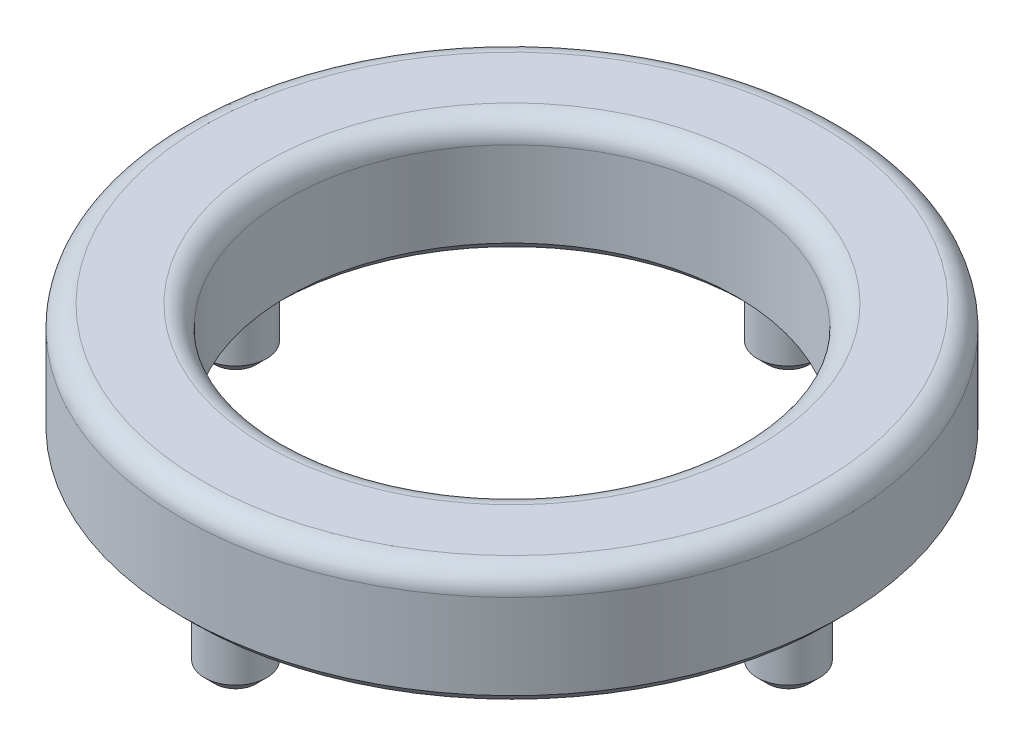
ISO-10303-21;
HEADER;
FILE_DESCRIPTION(('STEP AP214'),'2;1');
FILE_NAME('part.step','',(''),(''),'','','');
FILE_SCHEMA(('AUTOMOTIVE_DESIGN { 1 0 10303 214 1 1 1 1 }'));
ENDSEC;
DATA;
#1=APPLICATION_CONTEXT('core data for automotive mechanical design processes');
#2=APPLICATION_PROTOCOL_DEFINITION('international standard','automotive_design',2000,#1);
#3=PRODUCT_CONTEXT('',#1,'mechanical');
#4=PRODUCT('Part','Part','',(#3));
#5=PRODUCT_RELATED_PRODUCT_CATEGORY('part','',(#4));
#6=PRODUCT_DEFINITION_FORMATION('','',#4);
#7=PRODUCT_DEFINITION_CONTEXT('part definition',#1,'design');
#8=PRODUCT_DEFINITION('design','',#6,#7);
#9=PRODUCT_DEFINITION_SHAPE('','',#8);
#10=(LENGTH_UNIT() NAMED_UNIT(*) SI_UNIT(.MILLI.,.METRE.));
#11=(NAMED_UNIT(*) PLANE_ANGLE_UNIT() SI_UNIT($,.RADIAN.));
#12=(NAMED_UNIT(*) SI_UNIT($,.STERADIAN.) SOLID_ANGLE_UNIT());
#13=UNCERTAINTY_MEASURE_WITH_UNIT(LENGTH_MEASURE(1.E-05),#10,'distance_accuracy_value','');
#14=(GEOMETRIC_REPRESENTATION_CONTEXT(3) GLOBAL_UNCERTAINTY_ASSIGNED_CONTEXT((#13)) GLOBAL_UNIT_ASSIGNED_CONTEXT((#10,
#11,#12)) REPRESENTATION_CONTEXT('',''));
#15=CARTESIAN_POINT('',(0.,0.,0.));
#16=DIRECTION('',(0.,0.,1.));
#17=DIRECTION('',(1.,0.,0.));
#18=AXIS2_PLACEMENT_3D('',#15,#16,#17);
#19=CARTESIAN_POINT('',(0.,11.,0.));
#20=DIRECTION('',(0.,1.,0.));
#21=DIRECTION('',(0.,0.,1.));
#22=AXIS2_PLACEMENT_3D('',#19,#20,#21);
#23=PLANE('',#22);
#24=CARTESIAN_POINT('',(0.,11.,0.));
#25=DIRECTION('',(0.,1.,0.));
#26=DIRECTION('',(0.,0.,1.));
#27=AXIS2_PLACEMENT_3D('',#24,#25,#26);
#28=CIRCLE('',#27,23.15);
#29=CARTESIAN_POINT('',(0.,11.,23.15));
#30=VERTEX_POINT('',#29);
#31=EDGE_CURVE('E74',#30,#30,#28,.F.);
#32=ORIENTED_EDGE('',*,*,#31,.T.);
#33=EDGE_LOOP('',(#32));
#34=FACE_BOUND('',#33,.T.);
#35=CARTESIAN_POINT('',(0.,11.,0.));
#36=DIRECTION('',(0.,1.,0.));
#37=DIRECTION('',(0.,0.,1.));
#38=AXIS2_PLACEMENT_3D('',#35,#36,#37);
#39=CIRCLE('',#38,29.);
#40=CARTESIAN_POINT('',(0.,11.,29.));
#41=VERTEX_POINT('',#40);
#42=EDGE_CURVE('E77',#41,#41,#39,.T.);
#43=ORIENTED_EDGE('',*,*,#42,.T.);
#44=EDGE_LOOP('',(#43));
#45=FACE_BOUND('',#44,.T.);
#46=ADVANCED_FACE('F39',(#34,#45),#23,.T.);
#47=CARTESIAN_POINT('',(0.,0.,0.));
#48=DIRECTION('',(0.,1.,0.));
#49=DIRECTION('',(0.,0.,1.));
#50=AXIS2_PLACEMENT_3D('',#47,#48,#49);
#51=PLANE('',#50);
#52=CARTESIAN_POINT('',(26.,0.,0.));
#53=DIRECTION('',(0.,1.,0.));
#54=DIRECTION('',(0.,0.,1.));
#55=AXIS2_PLACEMENT_3D('',#52,#53,#54);
#56=CIRCLE('',#55,3.325);
#57=CARTESIAN_POINT('',(26.,0.,3.325));
#58=VERTEX_POINT('',#57);
#59=EDGE_CURVE('E59',#58,#58,#56,.T.);
#60=ORIENTED_EDGE('',*,*,#59,.T.);
#61=EDGE_LOOP('',(#60));
#62=FACE_BOUND('',#61,.T.);
#63=CARTESIAN_POINT('',(0.,0.,26.));
#64=DIRECTION('',(0.,1.,0.));
#65=DIRECTION('',(0.,0.,1.));
#66=AXIS2_PLACEMENT_3D('',#63,#64,#65);
#67=CIRCLE('',#66,3.325);
#68=CARTESIAN_POINT('',(0.,0.,29.325));
#69=VERTEX_POINT('',#68);
#70=EDGE_CURVE('E62',#69,#69,#67,.T.);
#71=ORIENTED_EDGE('',*,*,#70,.T.);
#72=EDGE_LOOP('',(#71));
#73=FACE_BOUND('',#72,.T.);
#74=CARTESIAN_POINT('',(-26.,0.,0.));
#75=DIRECTION('',(0.,1.,0.));
#76=DIRECTION('',(0.,0.,1.));
#77=AXIS2_PLACEMENT_3D('',#74,#75,#76);
#78=CIRCLE('',#77,3.325);
#79=CARTESIAN_POINT('',(-26.,0.,3.325));
#80=VERTEX_POINT('',#79);
#81=EDGE_CURVE('E65',#80,#80,#78,.T.);
#82=ORIENTED_EDGE('',*,*,#81,.T.);
#83=EDGE_LOOP('',(#82));
#84=FACE_BOUND('',#83,.T.);
#85=CARTESIAN_POINT('',(0.,0.,-26.));
#86=DIRECTION('',(0.,1.,0.));
#87=DIRECTION('',(0.,0.,1.));
#88=AXIS2_PLACEMENT_3D('',#85,#86,#87);
#89=CIRCLE('',#88,3.325);
#90=CARTESIAN_POINT('',(0.,0.,-22.675));
#91=VERTEX_POINT('',#90);
#92=EDGE_CURVE('E68',#91,#91,#89,.T.);
#93=ORIENTED_EDGE('',*,*,#92,.T.);
#94=EDGE_LOOP('',(#93));
#95=FACE_BOUND('',#94,.T.);
#96=CARTESIAN_POINT('',(0.,0.,0.));
#97=DIRECTION('',(0.,1.,0.));
#98=DIRECTION('',(0.,0.,1.));
#99=AXIS2_PLACEMENT_3D('',#96,#97,#98);
#100=CIRCLE('',#99,22.15);
#101=CARTESIAN_POINT('',(0.,0.,22.15));
#102=VERTEX_POINT('',#101);
#103=EDGE_CURVE('E89',#102,#102,#100,.T.);
#104=ORIENTED_EDGE('',*,*,#103,.T.);
#105=EDGE_LOOP('',(#104));
#106=FACE_BOUND('',#105,.T.);
#107=CARTESIAN_POINT('',(0.,0.,0.));
#108=DIRECTION('',(0.,1.,0.));
#109=DIRECTION('',(0.,0.,1.));
#110=AXIS2_PLACEMENT_3D('',#107,#108,#109);
#111=CIRCLE('',#110,30.);
#112=CARTESIAN_POINT('',(0.,0.,30.));
#113=VERTEX_POINT('',#112);
#114=EDGE_CURVE('E92',#113,#113,#111,.F.);
#115=ORIENTED_EDGE('',*,*,#114,.T.);
#116=EDGE_LOOP('',(#115));
#117=FACE_BOUND('',#116,.T.);
#118=ADVANCED_FACE('F141',(#62,#73,#84,#95,#106,#117),#51,.F.);
#119=CARTESIAN_POINT('',(0.,11.,0.));
#120=DIRECTION('',(0.,-1.,0.));
#121=DIRECTION('',(0.,0.,-1.));
#122=AXIS2_PLACEMENT_3D('',#119,#120,#121);
#123=CYLINDRICAL_SURFACE('',#122,31.);
#124=CARTESIAN_POINT('',(0.,9.,0.));
#125=DIRECTION('',(0.,1.,0.));
#126=DIRECTION('',(0.,0.,1.));
#127=AXIS2_PLACEMENT_3D('',#124,#125,#126);
#128=CIRCLE('',#127,31.);
#129=CARTESIAN_POINT('',(0.,9.,31.));
#130=VERTEX_POINT('',#129);
#131=EDGE_CURVE('E71',#130,#130,#128,.F.);
#132=ORIENTED_EDGE('',*,*,#131,.T.);
#133=EDGE_LOOP('',(#132));
#134=FACE_BOUND('',#133,.T.);
#135=CARTESIAN_POINT('',(0.,1.00000000000001,0.));
#136=DIRECTION('',(0.,1.,0.));
#137=DIRECTION('',(0.,0.,1.));
#138=AXIS2_PLACEMENT_3D('',#135,#136,#137);
#139=CIRCLE('',#138,31.);
#140=CARTESIAN_POINT('',(0.,1.00000000000001,31.));
#141=VERTEX_POINT('',#140);
#142=EDGE_CURVE('E83',#141,#141,#139,.T.);
#143=ORIENTED_EDGE('',*,*,#142,.T.);
#144=EDGE_LOOP('',(#143));
#145=FACE_BOUND('',#144,.T.);
#146=ADVANCED_FACE('F147',(#134,#145),#123,.T.);
#147=CARTESIAN_POINT('',(0.,11.,0.));
#148=DIRECTION('',(0.,-1.,0.));
#149=DIRECTION('',(0.,0.,-1.));
#150=AXIS2_PLACEMENT_3D('',#147,#148,#149);
#151=CYLINDRICAL_SURFACE('',#150,21.15);
#152=CARTESIAN_POINT('',(0.,9.,0.));
#153=DIRECTION('',(0.,1.,0.));
#154=DIRECTION('',(0.,0.,1.));
#155=AXIS2_PLACEMENT_3D('',#152,#153,#154);
#156=CIRCLE('',#155,21.15);
#157=CARTESIAN_POINT('',(0.,9.,21.15));
#158=VERTEX_POINT('',#157);
#159=EDGE_CURVE('E80',#158,#158,#156,.T.);
#160=ORIENTED_EDGE('',*,*,#159,.T.);
#161=EDGE_LOOP('',(#160));
#162=FACE_BOUND('',#161,.T.);
#163=CARTESIAN_POINT('',(0.,0.999999999999997,0.));
#164=DIRECTION('',(0.,1.,0.));
#165=DIRECTION('',(0.,0.,1.));
#166=AXIS2_PLACEMENT_3D('',#163,#164,#165);
#167=CIRCLE('',#166,21.15);
#168=CARTESIAN_POINT('',(0.,0.999999999999997,21.15));
#169=VERTEX_POINT('',#168);
#170=EDGE_CURVE('E86',#169,#169,#167,.F.);
#171=ORIENTED_EDGE('',*,*,#170,.T.);
#172=EDGE_LOOP('',(#171));
#173=FACE_BOUND('',#172,.T.);
#174=ADVANCED_FACE('F152',(#162,#173),#151,.F.);
#175=CARTESIAN_POINT('',(0.,-6.,-26.));
#176=DIRECTION('',(0.,1.,0.));
#177=DIRECTION('',(0.,0.,1.));
#178=AXIS2_PLACEMENT_3D('',#175,#176,#177);
#179=CYLINDRICAL_SURFACE('',#178,2.925);
#180=CARTESIAN_POINT('',(0.,-0.4,-26.));
#181=DIRECTION('',(0.,1.,0.));
#182=DIRECTION('',(0.,0.,1.));
#183=AXIS2_PLACEMENT_3D('',#180,#181,#182);
#184=CIRCLE('',#183,2.925);
#185=CARTESIAN_POINT('',(0.,-0.4,-23.075));
#186=VERTEX_POINT('',#185);
#187=EDGE_CURVE('E11',#186,#186,#184,.F.);
#188=ORIENTED_EDGE('',*,*,#187,.T.);
#189=EDGE_LOOP('',(#188));
#190=FACE_BOUND('',#189,.T.);
#191=CARTESIAN_POINT('',(0.,-4.99999999999999,-26.));
#192=DIRECTION('',(0.,1.,0.));
#193=DIRECTION('',(0.,0.,1.));
#194=AXIS2_PLACEMENT_3D('',#191,#192,#193);
#195=CIRCLE('',#194,2.925);
#196=CARTESIAN_POINT('',(0.,-4.99999999999999,-23.075));
#197=VERTEX_POINT('',#196);
#198=EDGE_CURVE('E110',#197,#197,#195,.T.);
#199=ORIENTED_EDGE('',*,*,#198,.T.);
#200=EDGE_LOOP('',(#199));
#201=FACE_BOUND('',#200,.T.);
#202=ADVANCED_FACE('F159',(#190,#201),#179,.T.);
#203=CARTESIAN_POINT('',(0.,-6.,0.));
#204=DIRECTION('',(0.,1.,0.));
#205=DIRECTION('',(0.,0.,1.));
#206=AXIS2_PLACEMENT_3D('',#203,#204,#205);
#207=PLANE('',#206);
#208=CARTESIAN_POINT('',(0.,-6.,-26.));
#209=DIRECTION('',(0.,1.,0.));
#210=DIRECTION('',(0.,0.,1.));
#211=AXIS2_PLACEMENT_3D('',#208,#209,#210);
#212=CIRCLE('',#211,1.92499999999998);
#213=CARTESIAN_POINT('',(0.,-6.,-24.075));
#214=VERTEX_POINT('',#213);
#215=EDGE_CURVE('E107',#214,#214,#212,.F.);
#216=ORIENTED_EDGE('',*,*,#215,.T.);
#217=EDGE_LOOP('',(#216));
#218=FACE_BOUND('',#217,.T.);
#219=ADVANCED_FACE('F264',(#218),#207,.F.);
#220=CARTESIAN_POINT('',(0.,-6.,26.));
#221=DIRECTION('',(0.,1.,0.));
#222=DIRECTION('',(0.,0.,1.));
#223=AXIS2_PLACEMENT_3D('',#220,#221,#222);
#224=CYLINDRICAL_SURFACE('',#223,2.925);
#225=CARTESIAN_POINT('',(0.,-0.4,26.));
#226=DIRECTION('',(0.,1.,0.));
#227=DIRECTION('',(0.,0.,1.));
#228=AXIS2_PLACEMENT_3D('',#225,#226,#227);
#229=CIRCLE('',#228,2.925);
#230=CARTESIAN_POINT('',(0.,-0.4,28.925));
#231=VERTEX_POINT('',#230);
#232=EDGE_CURVE('E50',#231,#231,#229,.F.);
#233=ORIENTED_EDGE('',*,*,#232,.T.);
#234=EDGE_LOOP('',(#233));
#235=FACE_BOUND('',#234,.T.);
#236=CARTESIAN_POINT('',(0.,-4.99999999999999,26.));
#237=DIRECTION('',(0.,1.,0.));
#238=DIRECTION('',(0.,0.,1.));
#239=AXIS2_PLACEMENT_3D('',#236,#237,#238);
#240=CIRCLE('',#239,2.925);
#241=CARTESIAN_POINT('',(0.,-4.99999999999999,28.925));
#242=VERTEX_POINT('',#241);
#243=EDGE_CURVE('E98',#242,#242,#240,.T.);
#244=ORIENTED_EDGE('',*,*,#243,.T.);
#245=EDGE_LOOP('',(#244));
#246=FACE_BOUND('',#245,.T.);
#247=ADVANCED_FACE('F259',(#235,#246),#224,.T.);
#248=CARTESIAN_POINT('',(0.,-6.,26.));
#249=DIRECTION('',(0.,1.,0.));
#250=DIRECTION('',(0.,0.,1.));
#251=AXIS2_PLACEMENT_3D('',#248,#249,#250);
#252=PLANE('',#251);
#253=CARTESIAN_POINT('',(0.,-6.,26.));
#254=DIRECTION('',(0.,1.,0.));
#255=DIRECTION('',(0.,0.,1.));
#256=AXIS2_PLACEMENT_3D('',#253,#254,#255);
#257=CIRCLE('',#256,1.92499999999998);
#258=CARTESIAN_POINT('',(0.,-6.,27.925));
#259=VERTEX_POINT('',#258);
#260=EDGE_CURVE('E95',#259,#259,#257,.F.);
#261=ORIENTED_EDGE('',*,*,#260,.T.);
#262=EDGE_LOOP('',(#261));
#263=FACE_BOUND('',#262,.T.);
#264=ADVANCED_FACE('F252',(#263),#252,.F.);
#265=CARTESIAN_POINT('',(-26.,-6.,0.));
#266=DIRECTION('',(0.,1.,0.));
#267=DIRECTION('',(0.,0.,1.));
#268=AXIS2_PLACEMENT_3D('',#265,#266,#267);
#269=CYLINDRICAL_SURFACE('',#268,2.925);
#270=CARTESIAN_POINT('',(-26.,-0.4,0.));
#271=DIRECTION('',(0.,1.,0.));
#272=DIRECTION('',(0.,0.,1.));
#273=AXIS2_PLACEMENT_3D('',#270,#271,#272);
#274=CIRCLE('',#273,2.925);
#275=CARTESIAN_POINT('',(-26.,-0.4,2.925));
#276=VERTEX_POINT('',#275);
#277=EDGE_CURVE('E46',#276,#276,#274,.F.);
#278=ORIENTED_EDGE('',*,*,#277,.T.);
#279=EDGE_LOOP('',(#278));
#280=FACE_BOUND('',#279,.T.);
#281=CARTESIAN_POINT('',(-26.,-4.99999999999998,0.));
#282=DIRECTION('',(0.,1.,0.));
#283=DIRECTION('',(0.,0.,1.));
#284=AXIS2_PLACEMENT_3D('',#281,#282,#283);
#285=CIRCLE('',#284,2.925);
#286=CARTESIAN_POINT('',(-26.,-4.99999999999998,2.925));
#287=VERTEX_POINT('',#286);
#288=EDGE_CURVE('E116',#287,#287,#285,.T.);
#289=ORIENTED_EDGE('',*,*,#288,.T.);
#290=EDGE_LOOP('',(#289));
#291=FACE_BOUND('',#290,.T.);
#292=ADVANCED_FACE('F120',(#280,#291),#269,.T.);
#293=CARTESIAN_POINT('',(-26.,-6.,0.));
#294=DIRECTION('',(0.,1.,0.));
#295=DIRECTION('',(0.,0.,1.));
#296=AXIS2_PLACEMENT_3D('',#293,#294,#295);
#297=PLANE('',#296);
#298=CARTESIAN_POINT('',(-26.,-6.,0.));
#299=DIRECTION('',(0.,1.,0.));
#300=DIRECTION('',(0.,0.,1.));
#301=AXIS2_PLACEMENT_3D('',#298,#299,#300);
#302=CIRCLE('',#301,1.92499999999998);
#303=CARTESIAN_POINT('',(-26.,-6.,1.92499999999998));
#304=VERTEX_POINT('',#303);
#305=EDGE_CURVE('E113',#304,#304,#302,.F.);
#306=ORIENTED_EDGE('',*,*,#305,.T.);
#307=EDGE_LOOP('',(#306));
#308=FACE_BOUND('',#307,.T.);
#309=ADVANCED_FACE('F239',(#308),#297,.F.);
#310=CARTESIAN_POINT('',(26.,-6.,0.));
#311=DIRECTION('',(0.,1.,0.));
#312=DIRECTION('',(0.,0.,1.));
#313=AXIS2_PLACEMENT_3D('',#310,#311,#312);
#314=CYLINDRICAL_SURFACE('',#313,2.925);
#315=CARTESIAN_POINT('',(26.,-0.4,0.));
#316=DIRECTION('',(0.,1.,0.));
#317=DIRECTION('',(0.,0.,1.));
#318=AXIS2_PLACEMENT_3D('',#315,#316,#317);
#319=CIRCLE('',#318,2.925);
#320=CARTESIAN_POINT('',(26.,-0.4,2.925));
#321=VERTEX_POINT('',#320);
#322=EDGE_CURVE('E54',#321,#321,#319,.F.);
#323=ORIENTED_EDGE('',*,*,#322,.T.);
#324=EDGE_LOOP('',(#323));
#325=FACE_BOUND('',#324,.T.);
#326=CARTESIAN_POINT('',(26.,-4.99999999999998,0.));
#327=DIRECTION('',(0.,1.,0.));
#328=DIRECTION('',(0.,0.,1.));
#329=AXIS2_PLACEMENT_3D('',#326,#327,#328);
#330=CIRCLE('',#329,2.925);
#331=CARTESIAN_POINT('',(26.,-4.99999999999998,2.925));
#332=VERTEX_POINT('',#331);
#333=EDGE_CURVE('E104',#332,#332,#330,.T.);
#334=ORIENTED_EDGE('',*,*,#333,.T.);
#335=EDGE_LOOP('',(#334));
#336=FACE_BOUND('',#335,.T.);
#337=ADVANCED_FACE('F135',(#325,#336),#314,.T.);
#338=CARTESIAN_POINT('',(26.,-6.,0.));
#339=DIRECTION('',(0.,1.,0.));
#340=DIRECTION('',(0.,0.,1.));
#341=AXIS2_PLACEMENT_3D('',#338,#339,#340);
#342=PLANE('',#341);
#343=CARTESIAN_POINT('',(26.,-6.,0.));
#344=DIRECTION('',(0.,1.,0.));
#345=DIRECTION('',(0.,0.,1.));
#346=AXIS2_PLACEMENT_3D('',#343,#344,#345);
#347=CIRCLE('',#346,1.92499999999998);
#348=CARTESIAN_POINT('',(26.,-6.,1.92499999999998));
#349=VERTEX_POINT('',#348);
#350=EDGE_CURVE('E101',#349,#349,#347,.F.);
#351=ORIENTED_EDGE('',*,*,#350,.T.);
#352=EDGE_LOOP('',(#351));
#353=FACE_BOUND('',#352,.T.);
#354=ADVANCED_FACE('F125',(#353),#342,.F.);
#355=CARTESIAN_POINT('',(-26.,-4.99999999999998,0.));
#356=DIRECTION('',(0.,1.,0.));
#357=DIRECTION('',(0.,0.,1.));
#358=AXIS2_PLACEMENT_3D('',#355,#356,#357);
#359=CONICAL_SURFACE('',#358,2.925,0.78539816339745);
#360=ORIENTED_EDGE('',*,*,#305,.F.);
#361=EDGE_LOOP('',(#360));
#362=FACE_BOUND('',#361,.T.);
#363=ORIENTED_EDGE('',*,*,#288,.F.);
#364=EDGE_LOOP('',(#363));
#365=FACE_BOUND('',#364,.T.);
#366=ADVANCED_FACE('F122',(#362,#365),#359,.T.);
#367=CARTESIAN_POINT('',(0.,-4.99999999999999,-26.));
#368=DIRECTION('',(0.,1.,0.));
#369=DIRECTION('',(0.,0.,1.));
#370=AXIS2_PLACEMENT_3D('',#367,#368,#369);
#371=CONICAL_SURFACE('',#370,2.925,0.78539816339745);
#372=ORIENTED_EDGE('',*,*,#215,.F.);
#373=EDGE_LOOP('',(#372));
#374=FACE_BOUND('',#373,.T.);
#375=ORIENTED_EDGE('',*,*,#198,.F.);
#376=EDGE_LOOP('',(#375));
#377=FACE_BOUND('',#376,.T.);
#378=ADVANCED_FACE('F124',(#374,#377),#371,.T.);
#379=CARTESIAN_POINT('',(26.,-4.99999999999998,0.));
#380=DIRECTION('',(0.,1.,0.));
#381=DIRECTION('',(0.,0.,1.));
#382=AXIS2_PLACEMENT_3D('',#379,#380,#381);
#383=CONICAL_SURFACE('',#382,2.925,0.78539816339745);
#384=ORIENTED_EDGE('',*,*,#350,.F.);
#385=EDGE_LOOP('',(#384));
#386=FACE_BOUND('',#385,.T.);
#387=ORIENTED_EDGE('',*,*,#333,.F.);
#388=EDGE_LOOP('',(#387));
#389=FACE_BOUND('',#388,.T.);
#390=ADVANCED_FACE('F132',(#386,#389),#383,.T.);
#391=CARTESIAN_POINT('',(0.,-4.99999999999999,26.));
#392=DIRECTION('',(0.,1.,0.));
#393=DIRECTION('',(0.,0.,1.));
#394=AXIS2_PLACEMENT_3D('',#391,#392,#393);
#395=CONICAL_SURFACE('',#394,2.925,0.78539816339745);
#396=ORIENTED_EDGE('',*,*,#260,.F.);
#397=EDGE_LOOP('',(#396));
#398=FACE_BOUND('',#397,.T.);
#399=ORIENTED_EDGE('',*,*,#243,.F.);
#400=EDGE_LOOP('',(#399));
#401=FACE_BOUND('',#400,.T.);
#402=ADVANCED_FACE('F178',(#398,#401),#395,.T.);
#403=CARTESIAN_POINT('',(0.,0.,0.));
#404=DIRECTION('',(0.,-1.,0.));
#405=DIRECTION('',(0.,0.,-1.));
#406=AXIS2_PLACEMENT_3D('',#403,#404,#405);
#407=CONICAL_SURFACE('',#406,22.15,0.785398163397447);
#408=ORIENTED_EDGE('',*,*,#170,.F.);
#409=EDGE_LOOP('',(#408));
#410=FACE_BOUND('',#409,.T.);
#411=ORIENTED_EDGE('',*,*,#103,.F.);
#412=EDGE_LOOP('',(#411));
#413=FACE_BOUND('',#412,.T.);
#414=ADVANCED_FACE('F168',(#410,#413),#407,.F.);
#415=CARTESIAN_POINT('',(0.,1.00000000000001,0.));
#416=DIRECTION('',(0.,1.,0.));
#417=DIRECTION('',(0.,0.,1.));
#418=AXIS2_PLACEMENT_3D('',#415,#416,#417);
#419=CONICAL_SURFACE('',#418,31.,0.785398163397447);
#420=ORIENTED_EDGE('',*,*,#114,.F.);
#421=EDGE_LOOP('',(#420));
#422=FACE_BOUND('',#421,.T.);
#423=ORIENTED_EDGE('',*,*,#142,.F.);
#424=EDGE_LOOP('',(#423));
#425=FACE_BOUND('',#424,.T.);
#426=ADVANCED_FACE('F165',(#422,#425),#419,.T.);
#427=CARTESIAN_POINT('',(0.,9.,0.));
#428=DIRECTION('',(0.,1.,0.));
#429=DIRECTION('',(0.,0.,1.));
#430=AXIS2_PLACEMENT_3D('',#427,#428,#429);
#431=TOROIDAL_SURFACE('',#430,23.15,2.);
#432=ORIENTED_EDGE('',*,*,#31,.F.);
#433=EDGE_LOOP('',(#432));
#434=FACE_BOUND('',#433,.T.);
#435=ORIENTED_EDGE('',*,*,#159,.F.);
#436=EDGE_LOOP('',(#435));
#437=FACE_BOUND('',#436,.T.);
#438=ADVANCED_FACE('F167',(#434,#437),#431,.T.);
#439=CARTESIAN_POINT('',(0.,9.,0.));
#440=DIRECTION('',(0.,1.,0.));
#441=DIRECTION('',(0.,0.,1.));
#442=AXIS2_PLACEMENT_3D('',#439,#440,#441);
#443=TOROIDAL_SURFACE('',#442,29.,2.);
#444=ORIENTED_EDGE('',*,*,#131,.F.);
#445=EDGE_LOOP('',(#444));
#446=FACE_BOUND('',#445,.T.);
#447=ORIENTED_EDGE('',*,*,#42,.F.);
#448=EDGE_LOOP('',(#447));
#449=FACE_BOUND('',#448,.T.);
#450=ADVANCED_FACE('F175',(#446,#449),#443,.T.);
#451=CARTESIAN_POINT('',(26.,-0.4,0.));
#452=DIRECTION('',(0.,1.,0.));
#453=DIRECTION('',(0.,0.,1.));
#454=AXIS2_PLACEMENT_3D('',#451,#452,#453);
#455=TOROIDAL_SURFACE('',#454,3.325,0.4);
#456=ORIENTED_EDGE('',*,*,#322,.F.);
#457=EDGE_LOOP('',(#456));
#458=FACE_BOUND('',#457,.T.);
#459=ORIENTED_EDGE('',*,*,#59,.F.);
#460=EDGE_LOOP('',(#459));
#461=FACE_BOUND('',#460,.T.);
#462=ADVANCED_FACE('F186',(#458,#461),#455,.F.);
#463=CARTESIAN_POINT('',(0.,-0.4,26.));
#464=DIRECTION('',(0.,1.,0.));
#465=DIRECTION('',(0.,0.,1.));
#466=AXIS2_PLACEMENT_3D('',#463,#464,#465);
#467=TOROIDAL_SURFACE('',#466,3.325,0.4);
#468=ORIENTED_EDGE('',*,*,#232,.F.);
#469=EDGE_LOOP('',(#468));
#470=FACE_BOUND('',#469,.T.);
#471=ORIENTED_EDGE('',*,*,#70,.F.);
#472=EDGE_LOOP('',(#471));
#473=FACE_BOUND('',#472,.T.);
#474=ADVANCED_FACE('F190',(#470,#473),#467,.F.);
#475=CARTESIAN_POINT('',(-26.,-0.4,0.));
#476=DIRECTION('',(0.,1.,0.));
#477=DIRECTION('',(0.,0.,1.));
#478=AXIS2_PLACEMENT_3D('',#475,#476,#477);
#479=TOROIDAL_SURFACE('',#478,3.325,0.4);
#480=ORIENTED_EDGE('',*,*,#277,.F.);
#481=EDGE_LOOP('',(#480));
#482=FACE_BOUND('',#481,.T.);
#483=ORIENTED_EDGE('',*,*,#81,.F.);
#484=EDGE_LOOP('',(#483));
#485=FACE_BOUND('',#484,.T.);
#486=ADVANCED_FACE('F193',(#482,#485),#479,.F.);
#487=CARTESIAN_POINT('',(0.,-0.4,-26.));
#488=DIRECTION('',(0.,1.,0.));
#489=DIRECTION('',(0.,0.,1.));
#490=AXIS2_PLACEMENT_3D('',#487,#488,#489);
#491=TOROIDAL_SURFACE('',#490,3.325,0.4);
#492=ORIENTED_EDGE('',*,*,#187,.F.);
#493=EDGE_LOOP('',(#492));
#494=FACE_BOUND('',#493,.T.);
#495=ORIENTED_EDGE('',*,*,#92,.F.);
#496=EDGE_LOOP('',(#495));
#497=FACE_BOUND('',#496,.T.);
#498=ADVANCED_FACE('F41',(#494,#497),#491,.F.);
#499=CLOSED_SHELL('',(#46,#118,#146,#174,#202,#219,#247,#264,#292,#309,#337,#354,#366,#378,#390,
#402,#414,#426,#438,#450,#462,#474,#486,#498));
#500=MANIFOLD_SOLID_BREP('B2',#499);
#501=ADVANCED_BREP_SHAPE_REPRESENTATION('',(#18,#500),#14);
#502=SHAPE_DEFINITION_REPRESENTATION(#9,#501);
ENDSEC;
END-ISO-10303-21;
